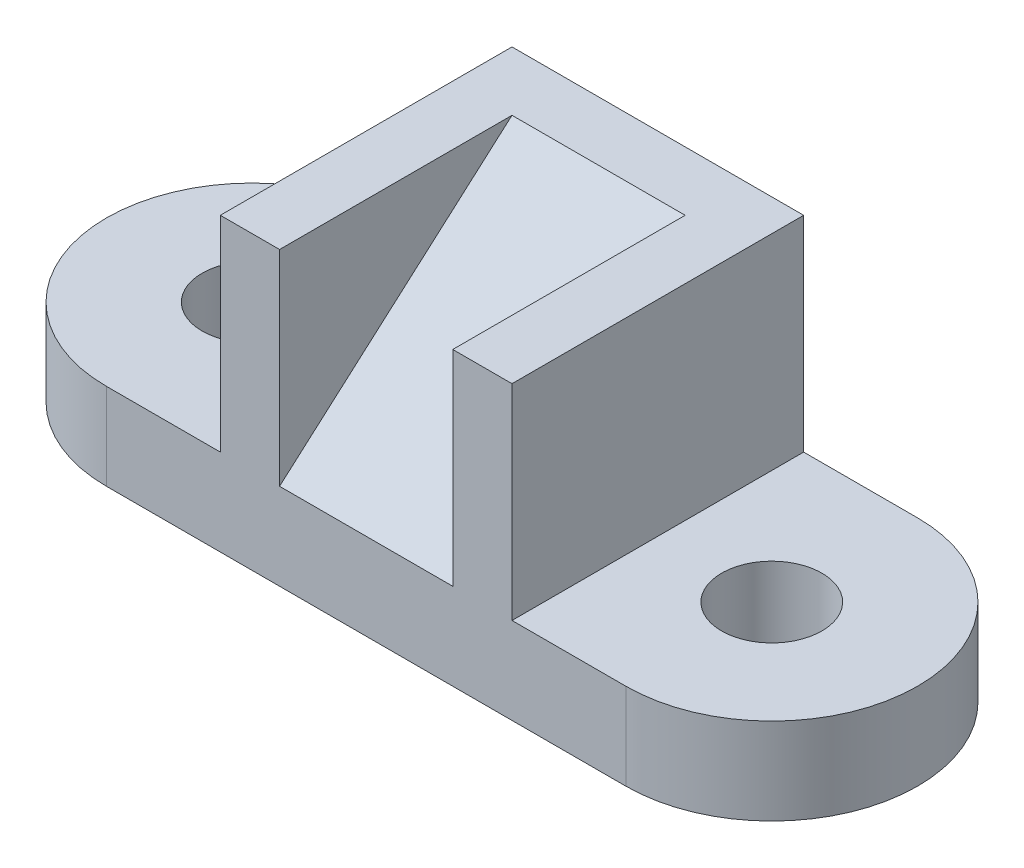
ISO-10303-21;
HEADER;
FILE_DESCRIPTION(('STEP AP214'),'2;1');
FILE_NAME('part.step','',(''),(''),'','','');
FILE_SCHEMA(('AUTOMOTIVE_DESIGN { 1 0 10303 214 1 1 1 1 }'));
ENDSEC;
DATA;
#1=APPLICATION_CONTEXT('core data for automotive mechanical design processes');
#2=APPLICATION_PROTOCOL_DEFINITION('international standard','automotive_design',2000,#1);
#3=PRODUCT_CONTEXT('',#1,'mechanical');
#4=PRODUCT('Part','Part','',(#3));
#5=PRODUCT_RELATED_PRODUCT_CATEGORY('part','',(#4));
#6=PRODUCT_DEFINITION_FORMATION('','',#4);
#7=PRODUCT_DEFINITION_CONTEXT('part definition',#1,'design');
#8=PRODUCT_DEFINITION('design','',#6,#7);
#9=PRODUCT_DEFINITION_SHAPE('','',#8);
#10=(LENGTH_UNIT() NAMED_UNIT(*) SI_UNIT(.MILLI.,.METRE.));
#11=(NAMED_UNIT(*) PLANE_ANGLE_UNIT() SI_UNIT($,.RADIAN.));
#12=(NAMED_UNIT(*) SI_UNIT($,.STERADIAN.) SOLID_ANGLE_UNIT());
#13=UNCERTAINTY_MEASURE_WITH_UNIT(LENGTH_MEASURE(1.E-05),#10,'distance_accuracy_value','');
#14=(GEOMETRIC_REPRESENTATION_CONTEXT(3) GLOBAL_UNCERTAINTY_ASSIGNED_CONTEXT((#13)) GLOBAL_UNIT_ASSIGNED_CONTEXT((#10,
#11,#12)) REPRESENTATION_CONTEXT('',''));
#15=CARTESIAN_POINT('',(0.,0.,0.));
#16=DIRECTION('',(0.,0.,1.));
#17=DIRECTION('',(1.,0.,0.));
#18=AXIS2_PLACEMENT_3D('',#15,#16,#17);
#19=CARTESIAN_POINT('',(-57.,19.,0.));
#20=DIRECTION('',(0.,1.,0.));
#21=DIRECTION('',(0.,0.,1.));
#22=AXIS2_PLACEMENT_3D('',#19,#20,#21);
#23=PLANE('',#22);
#24=CARTESIAN_POINT('',(-57.,19.,0.));
#25=DIRECTION('',(0.,1.,0.));
#26=DIRECTION('',(0.,0.,1.));
#27=AXIS2_PLACEMENT_3D('',#24,#25,#26);
#28=CIRCLE('',#27,11.);
#29=CARTESIAN_POINT('',(-57.,19.,11.));
#30=VERTEX_POINT('',#29);
#31=EDGE_CURVE('E208',#30,#30,#28,.T.);
#32=ORIENTED_EDGE('',*,*,#31,.F.);
#33=EDGE_LOOP('',(#32));
#34=FACE_BOUND('',#33,.T.);
#35=DIRECTION('',(1.,0.,0.));
#36=VECTOR('',#35,1.);
#37=CARTESIAN_POINT('',(-57.,19.,32.));
#38=LINE('',#37,#36);
#39=CARTESIAN_POINT('',(-57.,19.,32.));
#40=VERTEX_POINT('',#39);
#41=CARTESIAN_POINT('',(-32.,19.,32.));
#42=VERTEX_POINT('',#41);
#43=EDGE_CURVE('E219',#40,#42,#38,.T.);
#44=ORIENTED_EDGE('',*,*,#43,.T.);
#45=DIRECTION('',(0.,0.,-1.));
#46=VECTOR('',#45,1.);
#47=CARTESIAN_POINT('',(-32.,19.,0.));
#48=LINE('',#47,#46);
#49=CARTESIAN_POINT('',(-32.,19.,-32.));
#50=VERTEX_POINT('',#49);
#51=EDGE_CURVE('E69',#42,#50,#48,.T.);
#52=ORIENTED_EDGE('',*,*,#51,.T.);
#53=DIRECTION('',(-1.,0.,0.));
#54=VECTOR('',#53,1.);
#55=CARTESIAN_POINT('',(-57.,19.,-32.));
#56=LINE('',#55,#54);
#57=CARTESIAN_POINT('',(-57.,19.,-32.));
#58=VERTEX_POINT('',#57);
#59=EDGE_CURVE('E225',#50,#58,#56,.T.);
#60=ORIENTED_EDGE('',*,*,#59,.T.);
#61=CARTESIAN_POINT('',(-57.,19.,0.));
#62=DIRECTION('',(0.,1.,0.));
#63=DIRECTION('',(0.,0.,1.));
#64=AXIS2_PLACEMENT_3D('',#61,#62,#63);
#65=CIRCLE('',#64,32.);
#66=EDGE_CURVE('E213',#58,#40,#65,.T.);
#67=ORIENTED_EDGE('',*,*,#66,.T.);
#68=EDGE_LOOP('',(#44,#52,#60,#67));
#69=FACE_BOUND('',#68,.T.);
#70=ADVANCED_FACE('F45',(#34,#69),#23,.T.);
#71=CARTESIAN_POINT('',(-57.,19.,0.));
#72=DIRECTION('',(0.,-1.,0.));
#73=DIRECTION('',(0.,0.,-1.));
#74=AXIS2_PLACEMENT_3D('',#71,#72,#73);
#75=CYLINDRICAL_SURFACE('',#74,32.);
#76=CARTESIAN_POINT('',(-57.,0.,0.));
#77=DIRECTION('',(0.,1.,0.));
#78=DIRECTION('',(0.,0.,1.));
#79=AXIS2_PLACEMENT_3D('',#76,#77,#78);
#80=CIRCLE('',#79,32.);
#81=CARTESIAN_POINT('',(-57.,0.,-32.));
#82=VERTEX_POINT('',#81);
#83=CARTESIAN_POINT('',(-57.,0.,32.));
#84=VERTEX_POINT('',#83);
#85=EDGE_CURVE('E212',#82,#84,#80,.T.);
#86=ORIENTED_EDGE('',*,*,#85,.T.);
#87=DIRECTION('',(0.,-1.,0.));
#88=VECTOR('',#87,1.);
#89=CARTESIAN_POINT('',(-57.,19.,32.));
#90=LINE('',#89,#88);
#91=EDGE_CURVE('E11',#40,#84,#90,.T.);
#92=ORIENTED_EDGE('',*,*,#91,.F.);
#93=ORIENTED_EDGE('',*,*,#66,.F.);
#94=DIRECTION('',(0.,-1.,0.));
#95=VECTOR('',#94,1.);
#96=CARTESIAN_POINT('',(-57.,19.,-32.));
#97=LINE('',#96,#95);
#98=EDGE_CURVE('E229',#58,#82,#97,.T.);
#99=ORIENTED_EDGE('',*,*,#98,.T.);
#100=EDGE_LOOP('',(#86,#92,#93,#99));
#101=FACE_BOUND('',#100,.T.);
#102=ADVANCED_FACE('F47',(#101),#75,.T.);
#103=CARTESIAN_POINT('',(-57.,19.,32.));
#104=DIRECTION('',(0.,0.,-1.));
#105=DIRECTION('',(-1.,0.,0.));
#106=AXIS2_PLACEMENT_3D('',#103,#104,#105);
#107=PLANE('',#106);
#108=DIRECTION('',(1.,0.,0.));
#109=VECTOR('',#108,1.);
#110=CARTESIAN_POINT('',(-19.,19.,32.));
#111=LINE('',#110,#109);
#112=CARTESIAN_POINT('',(-19.,19.,32.));
#113=VERTEX_POINT('',#112);
#114=CARTESIAN_POINT('',(19.,19.,32.));
#115=VERTEX_POINT('',#114);
#116=EDGE_CURVE('E134',#113,#115,#111,.T.);
#117=ORIENTED_EDGE('',*,*,#116,.F.);
#118=DIRECTION('',(0.,-1.,0.));
#119=VECTOR('',#118,1.);
#120=CARTESIAN_POINT('',(-19.,64.,32.));
#121=LINE('',#120,#119);
#122=CARTESIAN_POINT('',(-19.,64.,32.));
#123=VERTEX_POINT('',#122);
#124=EDGE_CURVE('E141',#123,#113,#121,.T.);
#125=ORIENTED_EDGE('',*,*,#124,.F.);
#126=DIRECTION('',(1.,0.,0.));
#127=VECTOR('',#126,1.);
#128=CARTESIAN_POINT('',(-32.,64.,32.));
#129=LINE('',#128,#127);
#130=CARTESIAN_POINT('',(-32.,64.,32.));
#131=VERTEX_POINT('',#130);
#132=EDGE_CURVE('E183',#131,#123,#129,.T.);
#133=ORIENTED_EDGE('',*,*,#132,.F.);
#134=DIRECTION('',(0.,-1.,0.));
#135=VECTOR('',#134,1.);
#136=CARTESIAN_POINT('',(-32.,64.,32.));
#137=LINE('',#136,#135);
#138=EDGE_CURVE('E171',#131,#42,#137,.T.);
#139=ORIENTED_EDGE('',*,*,#138,.T.);
#140=ORIENTED_EDGE('',*,*,#43,.F.);
#141=ORIENTED_EDGE('',*,*,#91,.T.);
#142=DIRECTION('',(1.,0.,0.));
#143=VECTOR('',#142,1.);
#144=CARTESIAN_POINT('',(-57.,0.,32.));
#145=LINE('',#144,#143);
#146=CARTESIAN_POINT('',(57.,0.,32.));
#147=VERTEX_POINT('',#146);
#148=EDGE_CURVE('E233',#84,#147,#145,.T.);
#149=ORIENTED_EDGE('',*,*,#148,.T.);
#150=DIRECTION('',(0.,-1.,0.));
#151=VECTOR('',#150,1.);
#152=CARTESIAN_POINT('',(57.,19.,32.));
#153=LINE('',#152,#151);
#154=CARTESIAN_POINT('',(57.,19.,32.));
#155=VERTEX_POINT('',#154);
#156=EDGE_CURVE('E54',#155,#147,#153,.T.);
#157=ORIENTED_EDGE('',*,*,#156,.F.);
#158=CARTESIAN_POINT('',(32.,19.,32.));
#159=VERTEX_POINT('',#158);
#160=EDGE_CURVE('E217',#159,#155,#38,.T.);
#161=ORIENTED_EDGE('',*,*,#160,.F.);
#162=DIRECTION('',(0.,-1.,0.));
#163=VECTOR('',#162,1.);
#164=CARTESIAN_POINT('',(32.,64.,32.));
#165=LINE('',#164,#163);
#166=CARTESIAN_POINT('',(32.,64.,32.));
#167=VERTEX_POINT('',#166);
#168=EDGE_CURVE('E156',#167,#159,#165,.T.);
#169=ORIENTED_EDGE('',*,*,#168,.F.);
#170=CARTESIAN_POINT('',(19.,64.,32.));
#171=VERTEX_POINT('',#170);
#172=EDGE_CURVE('E187',#171,#167,#129,.T.);
#173=ORIENTED_EDGE('',*,*,#172,.F.);
#174=DIRECTION('',(0.,-1.,0.));
#175=VECTOR('',#174,1.);
#176=CARTESIAN_POINT('',(19.,64.,32.));
#177=LINE('',#176,#175);
#178=EDGE_CURVE('E61',#171,#115,#177,.T.);
#179=ORIENTED_EDGE('',*,*,#178,.T.);
#180=EDGE_LOOP('',(#117,#125,#133,#139,#140,#141,#149,#157,#161,#169,#173,#179));
#181=FACE_BOUND('',#180,.T.);
#182=ADVANCED_FACE('F150',(#181),#107,.F.);
#183=CARTESIAN_POINT('',(57.,19.,0.));
#184=DIRECTION('',(0.,-1.,0.));
#185=DIRECTION('',(0.,0.,-1.));
#186=AXIS2_PLACEMENT_3D('',#183,#184,#185);
#187=CYLINDRICAL_SURFACE('',#186,32.);
#188=CARTESIAN_POINT('',(57.,0.,0.));
#189=DIRECTION('',(0.,1.,0.));
#190=DIRECTION('',(0.,0.,1.));
#191=AXIS2_PLACEMENT_3D('',#188,#189,#190);
#192=CIRCLE('',#191,32.);
#193=CARTESIAN_POINT('',(57.,0.,-32.));
#194=VERTEX_POINT('',#193);
#195=EDGE_CURVE('E236',#147,#194,#192,.T.);
#196=ORIENTED_EDGE('',*,*,#195,.T.);
#197=DIRECTION('',(0.,-1.,0.));
#198=VECTOR('',#197,1.);
#199=CARTESIAN_POINT('',(57.,19.,-32.));
#200=LINE('',#199,#198);
#201=CARTESIAN_POINT('',(57.,19.,-32.));
#202=VERTEX_POINT('',#201);
#203=EDGE_CURVE('E244',#202,#194,#200,.T.);
#204=ORIENTED_EDGE('',*,*,#203,.F.);
#205=CARTESIAN_POINT('',(57.,19.,0.));
#206=DIRECTION('',(0.,1.,0.));
#207=DIRECTION('',(0.,0.,1.));
#208=AXIS2_PLACEMENT_3D('',#205,#206,#207);
#209=CIRCLE('',#208,32.);
#210=EDGE_CURVE('E222',#155,#202,#209,.T.);
#211=ORIENTED_EDGE('',*,*,#210,.F.);
#212=ORIENTED_EDGE('',*,*,#156,.T.);
#213=EDGE_LOOP('',(#196,#204,#211,#212));
#214=FACE_BOUND('',#213,.T.);
#215=ADVANCED_FACE('F253',(#214),#187,.T.);
#216=CARTESIAN_POINT('',(-57.,19.,-32.));
#217=DIRECTION('',(0.,0.,1.));
#218=DIRECTION('',(1.,0.,0.));
#219=AXIS2_PLACEMENT_3D('',#216,#217,#218);
#220=PLANE('',#219);
#221=DIRECTION('',(-1.,0.,0.));
#222=VECTOR('',#221,1.);
#223=CARTESIAN_POINT('',(-57.,0.,-32.));
#224=LINE('',#223,#222);
#225=EDGE_CURVE('E218',#194,#82,#224,.T.);
#226=ORIENTED_EDGE('',*,*,#225,.T.);
#227=ORIENTED_EDGE('',*,*,#98,.F.);
#228=ORIENTED_EDGE('',*,*,#59,.F.);
#229=DIRECTION('',(0.,1.,0.));
#230=VECTOR('',#229,1.);
#231=CARTESIAN_POINT('',(-32.,64.,-32.));
#232=LINE('',#231,#230);
#233=CARTESIAN_POINT('',(-32.,64.,-32.));
#234=VERTEX_POINT('',#233);
#235=EDGE_CURVE('E175',#50,#234,#232,.T.);
#236=ORIENTED_EDGE('',*,*,#235,.T.);
#237=DIRECTION('',(1.,0.,0.));
#238=VECTOR('',#237,1.);
#239=CARTESIAN_POINT('',(-32.,64.,-32.));
#240=LINE('',#239,#238);
#241=CARTESIAN_POINT('',(32.,64.,-32.));
#242=VERTEX_POINT('',#241);
#243=EDGE_CURVE('E182',#234,#242,#240,.T.);
#244=ORIENTED_EDGE('',*,*,#243,.T.);
#245=DIRECTION('',(0.,1.,0.));
#246=VECTOR('',#245,1.);
#247=CARTESIAN_POINT('',(32.,64.,-32.));
#248=LINE('',#247,#246);
#249=CARTESIAN_POINT('',(32.,19.,-32.));
#250=VERTEX_POINT('',#249);
#251=EDGE_CURVE('E164',#250,#242,#248,.T.);
#252=ORIENTED_EDGE('',*,*,#251,.F.);
#253=EDGE_CURVE('E226',#202,#250,#56,.T.);
#254=ORIENTED_EDGE('',*,*,#253,.F.);
#255=ORIENTED_EDGE('',*,*,#203,.T.);
#256=EDGE_LOOP('',(#226,#227,#228,#236,#244,#252,#254,#255));
#257=FACE_BOUND('',#256,.T.);
#258=ADVANCED_FACE('F263',(#257),#220,.F.);
#259=DIRECTION('',(0.,0.,-1.));
#260=VECTOR('',#259,1.);
#261=CARTESIAN_POINT('',(32.,19.,0.));
#262=LINE('',#261,#260);
#263=EDGE_CURVE('E186',#159,#250,#262,.T.);
#264=ORIENTED_EDGE('',*,*,#263,.F.);
#265=ORIENTED_EDGE('',*,*,#160,.T.);
#266=ORIENTED_EDGE('',*,*,#210,.T.);
#267=ORIENTED_EDGE('',*,*,#253,.T.);
#268=EDGE_LOOP('',(#264,#265,#266,#267));
#269=FACE_BOUND('',#268,.T.);
#270=CARTESIAN_POINT('',(57.,19.,0.));
#271=DIRECTION('',(0.,1.,0.));
#272=DIRECTION('',(0.,0.,1.));
#273=AXIS2_PLACEMENT_3D('',#270,#271,#272);
#274=CIRCLE('',#273,11.);
#275=CARTESIAN_POINT('',(57.,19.,11.));
#276=VERTEX_POINT('',#275);
#277=EDGE_CURVE('E201',#276,#276,#274,.T.);
#278=ORIENTED_EDGE('',*,*,#277,.F.);
#279=EDGE_LOOP('',(#278));
#280=FACE_BOUND('',#279,.T.);
#281=ADVANCED_FACE('F281',(#269,#280),#23,.T.);
#282=CARTESIAN_POINT('',(-57.,0.,0.));
#283=DIRECTION('',(0.,1.,0.));
#284=DIRECTION('',(0.,0.,1.));
#285=AXIS2_PLACEMENT_3D('',#282,#283,#284);
#286=PLANE('',#285);
#287=CARTESIAN_POINT('',(57.,0.,0.));
#288=DIRECTION('',(0.,1.,0.));
#289=DIRECTION('',(0.,0.,1.));
#290=AXIS2_PLACEMENT_3D('',#287,#288,#289);
#291=CIRCLE('',#290,11.);
#292=CARTESIAN_POINT('',(57.,0.,11.));
#293=VERTEX_POINT('',#292);
#294=EDGE_CURVE('E196',#293,#293,#291,.T.);
#295=ORIENTED_EDGE('',*,*,#294,.T.);
#296=EDGE_LOOP('',(#295));
#297=FACE_BOUND('',#296,.T.);
#298=ORIENTED_EDGE('',*,*,#195,.F.);
#299=ORIENTED_EDGE('',*,*,#148,.F.);
#300=ORIENTED_EDGE('',*,*,#85,.F.);
#301=ORIENTED_EDGE('',*,*,#225,.F.);
#302=EDGE_LOOP('',(#298,#299,#300,#301));
#303=FACE_BOUND('',#302,.T.);
#304=CARTESIAN_POINT('',(-57.,0.,0.));
#305=DIRECTION('',(0.,1.,0.));
#306=DIRECTION('',(0.,0.,1.));
#307=AXIS2_PLACEMENT_3D('',#304,#305,#306);
#308=CIRCLE('',#307,11.);
#309=CARTESIAN_POINT('',(-57.,0.,11.));
#310=VERTEX_POINT('',#309);
#311=EDGE_CURVE('E197',#310,#310,#308,.T.);
#312=ORIENTED_EDGE('',*,*,#311,.T.);
#313=EDGE_LOOP('',(#312));
#314=FACE_BOUND('',#313,.T.);
#315=ADVANCED_FACE('F258',(#297,#303,#314),#286,.F.);
#316=CARTESIAN_POINT('',(57.,0.,0.));
#317=DIRECTION('',(0.,1.,0.));
#318=DIRECTION('',(0.,0.,1.));
#319=AXIS2_PLACEMENT_3D('',#316,#317,#318);
#320=CYLINDRICAL_SURFACE('',#319,11.);
#321=ORIENTED_EDGE('',*,*,#277,.T.);
#322=EDGE_LOOP('',(#321));
#323=FACE_BOUND('',#322,.T.);
#324=ORIENTED_EDGE('',*,*,#294,.F.);
#325=EDGE_LOOP('',(#324));
#326=FACE_BOUND('',#325,.T.);
#327=ADVANCED_FACE('F311',(#323,#326),#320,.F.);
#328=CARTESIAN_POINT('',(-57.,0.,0.));
#329=DIRECTION('',(0.,1.,0.));
#330=DIRECTION('',(0.,0.,1.));
#331=AXIS2_PLACEMENT_3D('',#328,#329,#330);
#332=CYLINDRICAL_SURFACE('',#331,11.);
#333=ORIENTED_EDGE('',*,*,#31,.T.);
#334=EDGE_LOOP('',(#333));
#335=FACE_BOUND('',#334,.T.);
#336=ORIENTED_EDGE('',*,*,#311,.F.);
#337=EDGE_LOOP('',(#336));
#338=FACE_BOUND('',#337,.T.);
#339=ADVANCED_FACE('F295',(#335,#338),#332,.F.);
#340=CARTESIAN_POINT('',(-32.,64.,32.));
#341=DIRECTION('',(0.,1.,0.));
#342=DIRECTION('',(0.,0.,1.));
#343=AXIS2_PLACEMENT_3D('',#340,#341,#342);
#344=PLANE('',#343);
#345=DIRECTION('',(0.,0.,1.));
#346=VECTOR('',#345,1.);
#347=CARTESIAN_POINT('',(-19.,64.,-19.));
#348=LINE('',#347,#346);
#349=CARTESIAN_POINT('',(-19.,64.,-19.));
#350=VERTEX_POINT('',#349);
#351=EDGE_CURVE('E140',#350,#123,#348,.T.);
#352=ORIENTED_EDGE('',*,*,#351,.F.);
#353=DIRECTION('',(1.,0.,0.));
#354=VECTOR('',#353,1.);
#355=CARTESIAN_POINT('',(-19.,64.,-19.));
#356=LINE('',#355,#354);
#357=CARTESIAN_POINT('',(19.,64.,-19.));
#358=VERTEX_POINT('',#357);
#359=EDGE_CURVE('E136',#350,#358,#356,.T.);
#360=ORIENTED_EDGE('',*,*,#359,.T.);
#361=DIRECTION('',(0.,0.,1.));
#362=VECTOR('',#361,1.);
#363=CARTESIAN_POINT('',(19.,64.,-19.));
#364=LINE('',#363,#362);
#365=EDGE_CURVE('E148',#358,#171,#364,.T.);
#366=ORIENTED_EDGE('',*,*,#365,.T.);
#367=ORIENTED_EDGE('',*,*,#172,.T.);
#368=DIRECTION('',(0.,0.,1.));
#369=VECTOR('',#368,1.);
#370=CARTESIAN_POINT('',(32.,64.,32.));
#371=LINE('',#370,#369);
#372=EDGE_CURVE('E167',#242,#167,#371,.T.);
#373=ORIENTED_EDGE('',*,*,#372,.F.);
#374=ORIENTED_EDGE('',*,*,#243,.F.);
#375=DIRECTION('',(0.,0.,1.));
#376=VECTOR('',#375,1.);
#377=CARTESIAN_POINT('',(-32.,64.,32.));
#378=LINE('',#377,#376);
#379=EDGE_CURVE('E178',#234,#131,#378,.T.);
#380=ORIENTED_EDGE('',*,*,#379,.T.);
#381=ORIENTED_EDGE('',*,*,#132,.T.);
#382=EDGE_LOOP('',(#352,#360,#366,#367,#373,#374,#380,#381));
#383=FACE_BOUND('',#382,.T.);
#384=ADVANCED_FACE('F274',(#383),#344,.T.);
#385=CARTESIAN_POINT('',(-32.,0.,0.));
#386=DIRECTION('',(1.,0.,0.));
#387=DIRECTION('',(0.,0.,-1.));
#388=AXIS2_PLACEMENT_3D('',#385,#386,#387);
#389=PLANE('',#388);
#390=ORIENTED_EDGE('',*,*,#51,.F.);
#391=ORIENTED_EDGE('',*,*,#138,.F.);
#392=ORIENTED_EDGE('',*,*,#379,.F.);
#393=ORIENTED_EDGE('',*,*,#235,.F.);
#394=EDGE_LOOP('',(#390,#391,#392,#393));
#395=FACE_BOUND('',#394,.T.);
#396=ADVANCED_FACE('F286',(#395),#389,.F.);
#397=CARTESIAN_POINT('',(32.,0.,0.));
#398=DIRECTION('',(1.,0.,0.));
#399=DIRECTION('',(0.,0.,-1.));
#400=AXIS2_PLACEMENT_3D('',#397,#398,#399);
#401=PLANE('',#400);
#402=ORIENTED_EDGE('',*,*,#168,.T.);
#403=ORIENTED_EDGE('',*,*,#263,.T.);
#404=ORIENTED_EDGE('',*,*,#251,.T.);
#405=ORIENTED_EDGE('',*,*,#372,.T.);
#406=EDGE_LOOP('',(#402,#403,#404,#405));
#407=FACE_BOUND('',#406,.T.);
#408=ADVANCED_FACE('F278',(#407),#401,.T.);
#409=CARTESIAN_POINT('',(-19.,19.,32.));
#410=DIRECTION('',(0.,-0.749837855365092,-0.661621637086846));
#411=DIRECTION('',(0.,0.661621637086847,-0.749837855365093));
#412=AXIS2_PLACEMENT_3D('',#409,#410,#411);
#413=PLANE('',#412);
#414=DIRECTION('',(0.,0.661621637086846,-0.749837855365092));
#415=VECTOR('',#414,1.);
#416=CARTESIAN_POINT('',(19.,19.,32.));
#417=LINE('',#416,#415);
#418=EDGE_CURVE('E424',#115,#358,#417,.T.);
#419=ORIENTED_EDGE('',*,*,#418,.T.);
#420=ORIENTED_EDGE('',*,*,#359,.F.);
#421=DIRECTION('',(0.,0.661621637086846,-0.749837855365092));
#422=VECTOR('',#421,1.);
#423=CARTESIAN_POINT('',(-19.,19.,32.));
#424=LINE('',#423,#422);
#425=EDGE_CURVE('E130',#113,#350,#424,.T.);
#426=ORIENTED_EDGE('',*,*,#425,.F.);
#427=ORIENTED_EDGE('',*,*,#116,.T.);
#428=EDGE_LOOP('',(#419,#420,#426,#427));
#429=FACE_BOUND('',#428,.T.);
#430=ADVANCED_FACE('F132',(#429),#413,.F.);
#431=CARTESIAN_POINT('',(-19.,0.,0.));
#432=DIRECTION('',(-1.,0.,0.));
#433=DIRECTION('',(0.,0.,1.));
#434=AXIS2_PLACEMENT_3D('',#431,#432,#433);
#435=PLANE('',#434);
#436=ORIENTED_EDGE('',*,*,#124,.T.);
#437=ORIENTED_EDGE('',*,*,#425,.T.);
#438=ORIENTED_EDGE('',*,*,#351,.T.);
#439=EDGE_LOOP('',(#436,#437,#438));
#440=FACE_BOUND('',#439,.T.);
#441=ADVANCED_FACE('F144',(#440),#435,.F.);
#442=CARTESIAN_POINT('',(19.,0.,0.));
#443=DIRECTION('',(-1.,0.,0.));
#444=DIRECTION('',(0.,0.,1.));
#445=AXIS2_PLACEMENT_3D('',#442,#443,#444);
#446=PLANE('',#445);
#447=ORIENTED_EDGE('',*,*,#178,.F.);
#448=ORIENTED_EDGE('',*,*,#365,.F.);
#449=ORIENTED_EDGE('',*,*,#418,.F.);
#450=EDGE_LOOP('',(#447,#448,#449));
#451=FACE_BOUND('',#450,.T.);
#452=ADVANCED_FACE('F342',(#451),#446,.T.);
#453=CLOSED_SHELL('',(#70,#102,#182,#215,#258,#281,#315,#327,#339,#384,#396,#408,#430,#441,#452));
#454=MANIFOLD_SOLID_BREP('B2',#453);
#455=ADVANCED_BREP_SHAPE_REPRESENTATION('',(#18,#454),#14);
#456=SHAPE_DEFINITION_REPRESENTATION(#9,#455);
ENDSEC;
END-ISO-10303-21;
